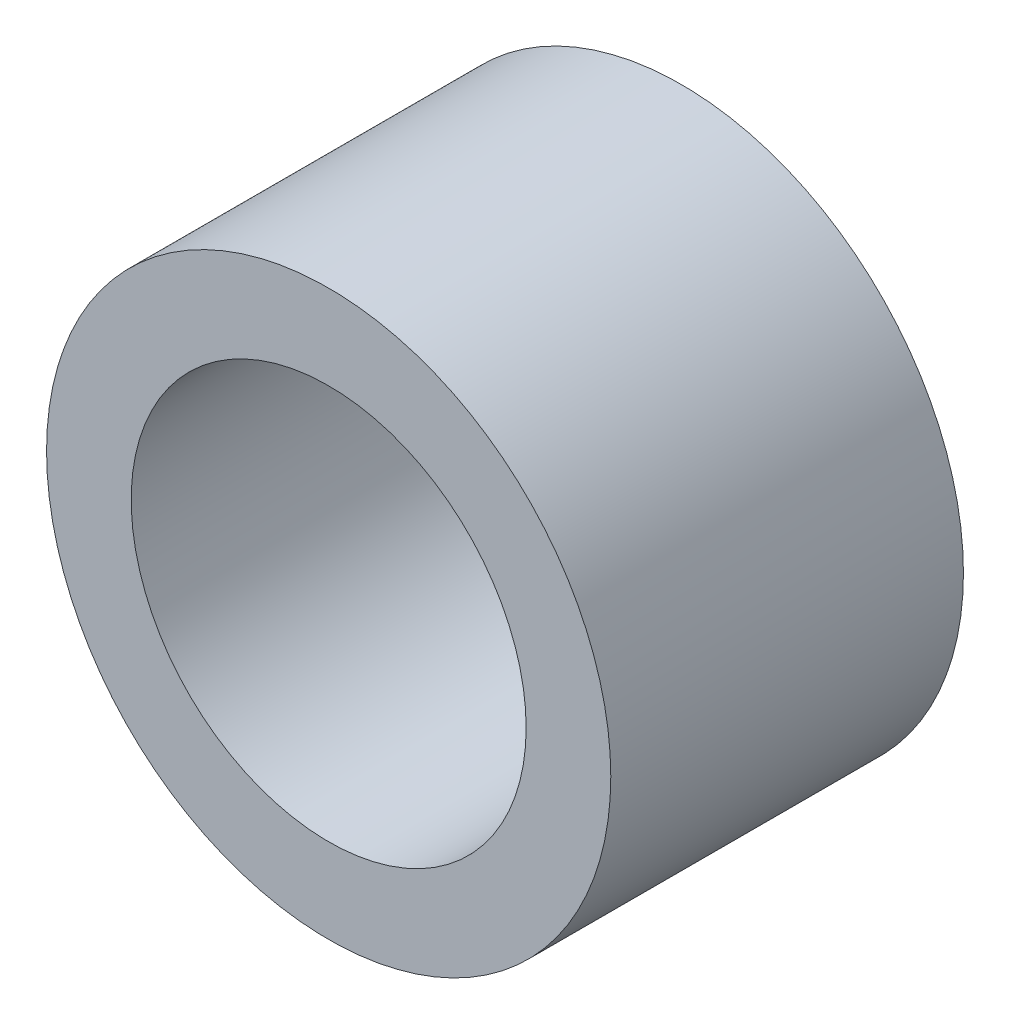
ISO-10303-21;
HEADER;
FILE_DESCRIPTION(('STEP AP214'),'2;1');
FILE_NAME('part.step','',(''),(''),'','','');
FILE_SCHEMA(('AUTOMOTIVE_DESIGN { 1 0 10303 214 1 1 1 1 }'));
ENDSEC;
DATA;
#1=APPLICATION_CONTEXT('core data for automotive mechanical design processes');
#2=APPLICATION_PROTOCOL_DEFINITION('international standard','automotive_design',2000,#1);
#3=PRODUCT_CONTEXT('',#1,'mechanical');
#4=PRODUCT('Part','Part','',(#3));
#5=PRODUCT_RELATED_PRODUCT_CATEGORY('part','',(#4));
#6=PRODUCT_DEFINITION_FORMATION('','',#4);
#7=PRODUCT_DEFINITION_CONTEXT('part definition',#1,'design');
#8=PRODUCT_DEFINITION('design','',#6,#7);
#9=PRODUCT_DEFINITION_SHAPE('','',#8);
#10=(LENGTH_UNIT() NAMED_UNIT(*) SI_UNIT(.MILLI.,.METRE.));
#11=(NAMED_UNIT(*) PLANE_ANGLE_UNIT() SI_UNIT($,.RADIAN.));
#12=(NAMED_UNIT(*) SI_UNIT($,.STERADIAN.) SOLID_ANGLE_UNIT());
#13=UNCERTAINTY_MEASURE_WITH_UNIT(LENGTH_MEASURE(1.E-05),#10,'distance_accuracy_value','');
#14=(GEOMETRIC_REPRESENTATION_CONTEXT(3) GLOBAL_UNCERTAINTY_ASSIGNED_CONTEXT((#13)) GLOBAL_UNIT_ASSIGNED_CONTEXT((#10,
#11,#12)) REPRESENTATION_CONTEXT('',''));
#15=CARTESIAN_POINT('',(0.,0.,0.));
#16=DIRECTION('',(0.,0.,1.));
#17=DIRECTION('',(1.,0.,0.));
#18=AXIS2_PLACEMENT_3D('',#15,#16,#17);
#19=CARTESIAN_POINT('',(0.,0.,3.175));
#20=DIRECTION('',(0.,0.,1.));
#21=DIRECTION('',(1.,0.,0.));
#22=AXIS2_PLACEMENT_3D('',#19,#20,#21);
#23=PLANE('',#22);
#24=CARTESIAN_POINT('',(0.,0.,3.175));
#25=DIRECTION('',(0.,0.,1.));
#26=DIRECTION('',(1.,0.,0.));
#27=AXIS2_PLACEMENT_3D('',#24,#25,#26);
#28=CIRCLE('',#27,5.08);
#29=CARTESIAN_POINT('',(5.08,0.,3.175));
#30=VERTEX_POINT('',#29);
#31=EDGE_CURVE('E10',#30,#30,#28,.T.);
#32=ORIENTED_EDGE('',*,*,#31,.T.);
#33=EDGE_LOOP('',(#32));
#34=FACE_BOUND('',#33,.T.);
#35=CARTESIAN_POINT('',(0.,0.,3.175));
#36=DIRECTION('',(0.,0.,1.));
#37=DIRECTION('',(1.,0.,0.));
#38=AXIS2_PLACEMENT_3D('',#35,#36,#37);
#39=CIRCLE('',#38,3.556);
#40=CARTESIAN_POINT('',(3.556,0.,3.175));
#41=VERTEX_POINT('',#40);
#42=EDGE_CURVE('E44',#41,#41,#39,.T.);
#43=ORIENTED_EDGE('',*,*,#42,.F.);
#44=EDGE_LOOP('',(#43));
#45=FACE_BOUND('',#44,.T.);
#46=ADVANCED_FACE('F33',(#34,#45),#23,.T.);
#47=CARTESIAN_POINT('',(0.,0.,-3.175));
#48=DIRECTION('',(0.,0.,1.));
#49=DIRECTION('',(1.,0.,0.));
#50=AXIS2_PLACEMENT_3D('',#47,#48,#49);
#51=PLANE('',#50);
#52=CARTESIAN_POINT('',(0.,0.,-3.175));
#53=DIRECTION('',(0.,0.,1.));
#54=DIRECTION('',(1.,0.,0.));
#55=AXIS2_PLACEMENT_3D('',#52,#53,#54);
#56=CIRCLE('',#55,5.08);
#57=CARTESIAN_POINT('',(5.08,0.,-3.175));
#58=VERTEX_POINT('',#57);
#59=EDGE_CURVE('E37',#58,#58,#56,.T.);
#60=ORIENTED_EDGE('',*,*,#59,.F.);
#61=EDGE_LOOP('',(#60));
#62=FACE_BOUND('',#61,.T.);
#63=CARTESIAN_POINT('',(0.,0.,-3.175));
#64=DIRECTION('',(0.,0.,1.));
#65=DIRECTION('',(1.,0.,0.));
#66=AXIS2_PLACEMENT_3D('',#63,#64,#65);
#67=CIRCLE('',#66,3.556);
#68=CARTESIAN_POINT('',(3.556,0.,-3.175));
#69=VERTEX_POINT('',#68);
#70=EDGE_CURVE('E46',#69,#69,#67,.T.);
#71=ORIENTED_EDGE('',*,*,#70,.T.);
#72=EDGE_LOOP('',(#71));
#73=FACE_BOUND('',#72,.T.);
#74=ADVANCED_FACE('F56',(#62,#73),#51,.F.);
#75=CARTESIAN_POINT('',(0.,0.,3.175));
#76=DIRECTION('',(0.,0.,-1.));
#77=DIRECTION('',(-1.,0.,0.));
#78=AXIS2_PLACEMENT_3D('',#75,#76,#77);
#79=CYLINDRICAL_SURFACE('',#78,5.08);
#80=ORIENTED_EDGE('',*,*,#31,.F.);
#81=EDGE_LOOP('',(#80));
#82=FACE_BOUND('',#81,.T.);
#83=ORIENTED_EDGE('',*,*,#59,.T.);
#84=EDGE_LOOP('',(#83));
#85=FACE_BOUND('',#84,.T.);
#86=ADVANCED_FACE('F35',(#82,#85),#79,.T.);
#87=CARTESIAN_POINT('',(0.,0.,3.175));
#88=DIRECTION('',(0.,0.,-1.));
#89=DIRECTION('',(-1.,0.,0.));
#90=AXIS2_PLACEMENT_3D('',#87,#88,#89);
#91=CYLINDRICAL_SURFACE('',#90,3.556);
#92=ORIENTED_EDGE('',*,*,#42,.T.);
#93=EDGE_LOOP('',(#92));
#94=FACE_BOUND('',#93,.T.);
#95=ORIENTED_EDGE('',*,*,#70,.F.);
#96=EDGE_LOOP('',(#95));
#97=FACE_BOUND('',#96,.T.);
#98=ADVANCED_FACE('F52',(#94,#97),#91,.F.);
#99=CLOSED_SHELL('',(#46,#74,#86,#98));
#100=MANIFOLD_SOLID_BREP('B2',#99);
#101=ADVANCED_BREP_SHAPE_REPRESENTATION('',(#18,#100),#14);
#102=SHAPE_DEFINITION_REPRESENTATION(#9,#101);
ENDSEC;
END-ISO-10303-21;
